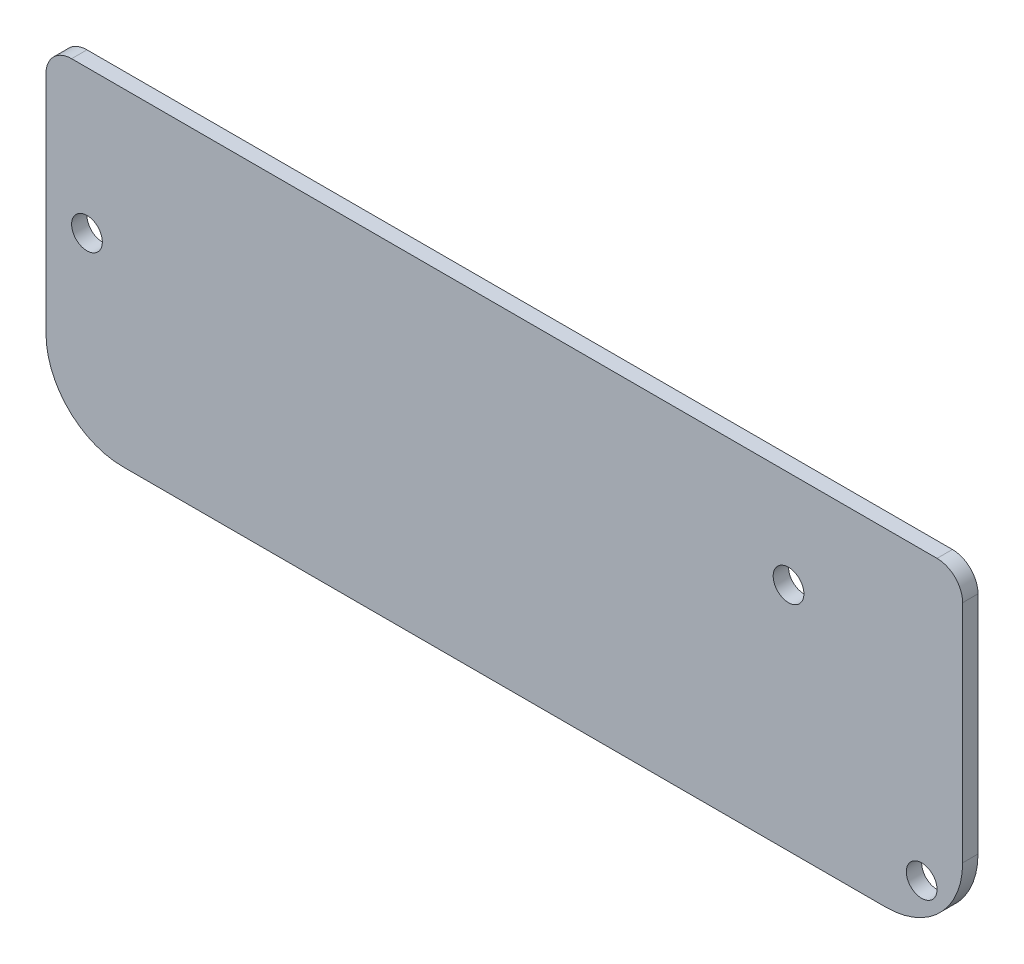
ISO-10303-21;
HEADER;
FILE_DESCRIPTION(('STEP AP214'),'2;1');
FILE_NAME('part.step','',(''),(''),'','','');
FILE_SCHEMA(('AUTOMOTIVE_DESIGN { 1 0 10303 214 1 1 1 1 }'));
ENDSEC;
DATA;
#1=APPLICATION_CONTEXT('core data for automotive mechanical design processes');
#2=APPLICATION_PROTOCOL_DEFINITION('international standard','automotive_design',2000,#1);
#3=PRODUCT_CONTEXT('',#1,'mechanical');
#4=PRODUCT('Part','Part','',(#3));
#5=PRODUCT_RELATED_PRODUCT_CATEGORY('part','',(#4));
#6=PRODUCT_DEFINITION_FORMATION('','',#4);
#7=PRODUCT_DEFINITION_CONTEXT('part definition',#1,'design');
#8=PRODUCT_DEFINITION('design','',#6,#7);
#9=PRODUCT_DEFINITION_SHAPE('','',#8);
#10=(LENGTH_UNIT() NAMED_UNIT(*) SI_UNIT(.MILLI.,.METRE.));
#11=(NAMED_UNIT(*) PLANE_ANGLE_UNIT() SI_UNIT($,.RADIAN.));
#12=(NAMED_UNIT(*) SI_UNIT($,.STERADIAN.) SOLID_ANGLE_UNIT());
#13=UNCERTAINTY_MEASURE_WITH_UNIT(LENGTH_MEASURE(1.E-05),#10,'distance_accuracy_value','');
#14=(GEOMETRIC_REPRESENTATION_CONTEXT(3) GLOBAL_UNCERTAINTY_ASSIGNED_CONTEXT((#13)) GLOBAL_UNIT_ASSIGNED_CONTEXT((#10,
#11,#12)) REPRESENTATION_CONTEXT('',''));
#15=CARTESIAN_POINT('',(0.,0.,0.));
#16=DIRECTION('',(0.,0.,1.));
#17=DIRECTION('',(1.,0.,0.));
#18=AXIS2_PLACEMENT_3D('',#15,#16,#17);
#19=CARTESIAN_POINT('',(277.101682981005,137.632253408396,3.));
#20=DIRECTION('',(0.,0.,-1.));
#21=DIRECTION('',(-1.,0.,0.));
#22=AXIS2_PLACEMENT_3D('',#19,#20,#21);
#23=CYLINDRICAL_SURFACE('',#22,5.);
#24=CARTESIAN_POINT('',(277.101682981005,137.632253408396,0.));
#25=DIRECTION('',(0.,0.,1.));
#26=DIRECTION('',(-1.,0.,0.));
#27=AXIS2_PLACEMENT_3D('',#24,#25,#26);
#28=CIRCLE('',#27,5.);
#29=CARTESIAN_POINT('',(282.101682981005,137.632253408396,0.));
#30=VERTEX_POINT('',#29);
#31=CARTESIAN_POINT('',(277.101682981005,142.632253408396,0.));
#32=VERTEX_POINT('',#31);
#33=EDGE_CURVE('E129',#30,#32,#28,.T.);
#34=ORIENTED_EDGE('',*,*,#33,.T.);
#35=DIRECTION('',(0.,0.,-1.));
#36=VECTOR('',#35,1.);
#37=CARTESIAN_POINT('',(277.101682981005,142.632253408396,3.));
#38=LINE('',#37,#36);
#39=CARTESIAN_POINT('',(277.101682981005,142.632253408396,3.));
#40=VERTEX_POINT('',#39);
#41=EDGE_CURVE('E11',#40,#32,#38,.T.);
#42=ORIENTED_EDGE('',*,*,#41,.F.);
#43=CARTESIAN_POINT('',(277.101682981005,137.632253408396,3.));
#44=DIRECTION('',(0.,0.,1.));
#45=DIRECTION('',(-1.,0.,0.));
#46=AXIS2_PLACEMENT_3D('',#43,#44,#45);
#47=CIRCLE('',#46,5.);
#48=CARTESIAN_POINT('',(282.101682981005,137.632253408396,3.));
#49=VERTEX_POINT('',#48);
#50=EDGE_CURVE('E144',#49,#40,#47,.T.);
#51=ORIENTED_EDGE('',*,*,#50,.F.);
#52=DIRECTION('',(0.,0.,-1.));
#53=VECTOR('',#52,1.);
#54=CARTESIAN_POINT('',(282.101682981005,137.632253408396,3.));
#55=LINE('',#54,#53);
#56=EDGE_CURVE('E125',#49,#30,#55,.T.);
#57=ORIENTED_EDGE('',*,*,#56,.T.);
#58=EDGE_LOOP('',(#34,#42,#51,#57));
#59=FACE_BOUND('',#58,.T.);
#60=ADVANCED_FACE('F33',(#59),#23,.T.);
#61=CARTESIAN_POINT('',(108.101682981005,142.632253408396,3.));
#62=DIRECTION('',(0.,-1.,0.));
#63=DIRECTION('',(0.,0.,-1.));
#64=AXIS2_PLACEMENT_3D('',#61,#62,#63);
#65=PLANE('',#64);
#66=DIRECTION('',(-1.,0.,0.));
#67=VECTOR('',#66,1.);
#68=CARTESIAN_POINT('',(108.101682981005,142.632253408396,0.));
#69=LINE('',#68,#67);
#70=CARTESIAN_POINT('',(108.101682981005,142.632253408396,0.));
#71=VERTEX_POINT('',#70);
#72=EDGE_CURVE('E132',#32,#71,#69,.T.);
#73=ORIENTED_EDGE('',*,*,#72,.T.);
#74=DIRECTION('',(0.,0.,-1.));
#75=VECTOR('',#74,1.);
#76=CARTESIAN_POINT('',(108.101682981005,142.632253408396,3.));
#77=LINE('',#76,#75);
#78=CARTESIAN_POINT('',(108.101682981005,142.632253408396,3.));
#79=VERTEX_POINT('',#78);
#80=EDGE_CURVE('E41',#79,#71,#77,.T.);
#81=ORIENTED_EDGE('',*,*,#80,.F.);
#82=DIRECTION('',(-1.,0.,0.));
#83=VECTOR('',#82,1.);
#84=CARTESIAN_POINT('',(108.101682981005,142.632253408396,3.));
#85=LINE('',#84,#83);
#86=EDGE_CURVE('E92',#40,#79,#85,.T.);
#87=ORIENTED_EDGE('',*,*,#86,.F.);
#88=ORIENTED_EDGE('',*,*,#41,.T.);
#89=EDGE_LOOP('',(#73,#81,#87,#88));
#90=FACE_BOUND('',#89,.T.);
#91=ADVANCED_FACE('F224',(#90),#65,.F.);
#92=CARTESIAN_POINT('',(108.101682981005,137.632253408396,3.));
#93=DIRECTION('',(0.,0.,-1.));
#94=DIRECTION('',(-1.,0.,0.));
#95=AXIS2_PLACEMENT_3D('',#92,#93,#94);
#96=CYLINDRICAL_SURFACE('',#95,5.);
#97=CARTESIAN_POINT('',(108.101682981005,137.632253408396,0.));
#98=DIRECTION('',(0.,0.,1.));
#99=DIRECTION('',(-1.,0.,0.));
#100=AXIS2_PLACEMENT_3D('',#97,#98,#99);
#101=CIRCLE('',#100,5.);
#102=CARTESIAN_POINT('',(103.101682981005,137.632253408396,0.));
#103=VERTEX_POINT('',#102);
#104=EDGE_CURVE('E135',#71,#103,#101,.T.);
#105=ORIENTED_EDGE('',*,*,#104,.T.);
#106=DIRECTION('',(0.,0.,-1.));
#107=VECTOR('',#106,1.);
#108=CARTESIAN_POINT('',(103.101682981005,137.632253408396,3.));
#109=LINE('',#108,#107);
#110=CARTESIAN_POINT('',(103.101682981005,137.632253408396,3.));
#111=VERTEX_POINT('',#110);
#112=EDGE_CURVE('E151',#111,#103,#109,.T.);
#113=ORIENTED_EDGE('',*,*,#112,.F.);
#114=CARTESIAN_POINT('',(108.101682981005,137.632253408396,3.));
#115=DIRECTION('',(0.,0.,1.));
#116=DIRECTION('',(-1.,0.,0.));
#117=AXIS2_PLACEMENT_3D('',#114,#115,#116);
#118=CIRCLE('',#117,5.);
#119=EDGE_CURVE('E159',#79,#111,#118,.T.);
#120=ORIENTED_EDGE('',*,*,#119,.F.);
#121=ORIENTED_EDGE('',*,*,#80,.T.);
#122=EDGE_LOOP('',(#105,#113,#120,#121));
#123=FACE_BOUND('',#122,.T.);
#124=ADVANCED_FACE('F157',(#123),#96,.T.);
#125=CARTESIAN_POINT('',(103.101682981005,93.6322534083958,3.));
#126=DIRECTION('',(1.,0.,0.));
#127=DIRECTION('',(0.,1.,0.));
#128=AXIS2_PLACEMENT_3D('',#125,#126,#127);
#129=PLANE('',#128);
#130=DIRECTION('',(0.,-1.,0.));
#131=VECTOR('',#130,1.);
#132=CARTESIAN_POINT('',(103.101682981005,93.6322534083958,0.));
#133=LINE('',#132,#131);
#134=CARTESIAN_POINT('',(103.101682981005,93.6322534083958,0.));
#135=VERTEX_POINT('',#134);
#136=EDGE_CURVE('E137',#103,#135,#133,.T.);
#137=ORIENTED_EDGE('',*,*,#136,.T.);
#138=DIRECTION('',(0.,0.,-1.));
#139=VECTOR('',#138,1.);
#140=CARTESIAN_POINT('',(103.101682981005,93.6322534083958,3.));
#141=LINE('',#140,#139);
#142=CARTESIAN_POINT('',(103.101682981005,93.6322534083958,3.));
#143=VERTEX_POINT('',#142);
#144=EDGE_CURVE('E148',#143,#135,#141,.T.);
#145=ORIENTED_EDGE('',*,*,#144,.F.);
#146=DIRECTION('',(0.,-1.,0.));
#147=VECTOR('',#146,1.);
#148=CARTESIAN_POINT('',(103.101682981005,93.6322534083958,3.));
#149=LINE('',#148,#147);
#150=EDGE_CURVE('E171',#111,#143,#149,.T.);
#151=ORIENTED_EDGE('',*,*,#150,.F.);
#152=ORIENTED_EDGE('',*,*,#112,.T.);
#153=EDGE_LOOP('',(#137,#145,#151,#152));
#154=FACE_BOUND('',#153,.T.);
#155=ADVANCED_FACE('F167',(#154),#129,.F.);
#156=CARTESIAN_POINT('',(118.101682981005,93.6322534083957,3.));
#157=DIRECTION('',(0.,0.,-1.));
#158=DIRECTION('',(-1.,0.,0.));
#159=AXIS2_PLACEMENT_3D('',#156,#157,#158);
#160=CYLINDRICAL_SURFACE('',#159,15.);
#161=CARTESIAN_POINT('',(118.101682981005,93.6322534083957,0.));
#162=DIRECTION('',(0.,0.,1.));
#163=DIRECTION('',(-1.,0.,0.));
#164=AXIS2_PLACEMENT_3D('',#161,#162,#163);
#165=CIRCLE('',#164,15.);
#166=CARTESIAN_POINT('',(118.101682981005,78.6322534083957,0.));
#167=VERTEX_POINT('',#166);
#168=EDGE_CURVE('E139',#135,#167,#165,.T.);
#169=ORIENTED_EDGE('',*,*,#168,.T.);
#170=DIRECTION('',(0.,0.,-1.));
#171=VECTOR('',#170,1.);
#172=CARTESIAN_POINT('',(118.101682981005,78.6322534083957,3.));
#173=LINE('',#172,#171);
#174=CARTESIAN_POINT('',(118.101682981005,78.6322534083957,3.));
#175=VERTEX_POINT('',#174);
#176=EDGE_CURVE('E120',#175,#167,#173,.T.);
#177=ORIENTED_EDGE('',*,*,#176,.F.);
#178=CARTESIAN_POINT('',(118.101682981005,93.6322534083957,3.));
#179=DIRECTION('',(0.,0.,1.));
#180=DIRECTION('',(-1.,0.,0.));
#181=AXIS2_PLACEMENT_3D('',#178,#179,#180);
#182=CIRCLE('',#181,15.);
#183=EDGE_CURVE('E111',#143,#175,#182,.T.);
#184=ORIENTED_EDGE('',*,*,#183,.F.);
#185=ORIENTED_EDGE('',*,*,#144,.T.);
#186=EDGE_LOOP('',(#169,#177,#184,#185));
#187=FACE_BOUND('',#186,.T.);
#188=ADVANCED_FACE('F170',(#187),#160,.T.);
#189=CARTESIAN_POINT('',(118.101682981005,78.6322534083957,3.));
#190=DIRECTION('',(0.,1.,0.));
#191=DIRECTION('',(0.,0.,1.));
#192=AXIS2_PLACEMENT_3D('',#189,#190,#191);
#193=PLANE('',#192);
#194=DIRECTION('',(1.,0.,0.));
#195=VECTOR('',#194,1.);
#196=CARTESIAN_POINT('',(118.101682981005,78.6322534083957,0.));
#197=LINE('',#196,#195);
#198=CARTESIAN_POINT('',(267.101682981005,78.6322534083957,0.));
#199=VERTEX_POINT('',#198);
#200=EDGE_CURVE('E119',#167,#199,#197,.T.);
#201=ORIENTED_EDGE('',*,*,#200,.T.);
#202=DIRECTION('',(0.,0.,-1.));
#203=VECTOR('',#202,1.);
#204=CARTESIAN_POINT('',(267.101682981005,78.6322534083957,3.));
#205=LINE('',#204,#203);
#206=CARTESIAN_POINT('',(267.101682981005,78.6322534083957,3.));
#207=VERTEX_POINT('',#206);
#208=EDGE_CURVE('E116',#207,#199,#205,.T.);
#209=ORIENTED_EDGE('',*,*,#208,.F.);
#210=DIRECTION('',(1.,0.,0.));
#211=VECTOR('',#210,1.);
#212=CARTESIAN_POINT('',(118.101682981005,78.6322534083957,3.));
#213=LINE('',#212,#211);
#214=EDGE_CURVE('E105',#175,#207,#213,.T.);
#215=ORIENTED_EDGE('',*,*,#214,.F.);
#216=ORIENTED_EDGE('',*,*,#176,.T.);
#217=EDGE_LOOP('',(#201,#209,#215,#216));
#218=FACE_BOUND('',#217,.T.);
#219=ADVANCED_FACE('F117',(#218),#193,.F.);
#220=CARTESIAN_POINT('',(267.101682981005,93.6322534083957,3.));
#221=DIRECTION('',(0.,0.,-1.));
#222=DIRECTION('',(-1.,0.,0.));
#223=AXIS2_PLACEMENT_3D('',#220,#221,#222);
#224=CYLINDRICAL_SURFACE('',#223,15.);
#225=CARTESIAN_POINT('',(267.101682981005,93.6322534083957,0.));
#226=DIRECTION('',(0.,0.,1.));
#227=DIRECTION('',(1.,0.,0.));
#228=AXIS2_PLACEMENT_3D('',#225,#226,#227);
#229=CIRCLE('',#228,15.);
#230=CARTESIAN_POINT('',(282.101682981005,93.6322534083957,0.));
#231=VERTEX_POINT('',#230);
#232=EDGE_CURVE('E78',#199,#231,#229,.T.);
#233=ORIENTED_EDGE('',*,*,#232,.T.);
#234=DIRECTION('',(0.,0.,-1.));
#235=VECTOR('',#234,1.);
#236=CARTESIAN_POINT('',(282.101682981005,93.6322534083957,3.));
#237=LINE('',#236,#235);
#238=CARTESIAN_POINT('',(282.101682981005,93.6322534083957,3.));
#239=VERTEX_POINT('',#238);
#240=EDGE_CURVE('E121',#239,#231,#237,.T.);
#241=ORIENTED_EDGE('',*,*,#240,.F.);
#242=CARTESIAN_POINT('',(267.101682981005,93.6322534083957,3.));
#243=DIRECTION('',(0.,0.,1.));
#244=DIRECTION('',(1.,0.,0.));
#245=AXIS2_PLACEMENT_3D('',#242,#243,#244);
#246=CIRCLE('',#245,15.);
#247=EDGE_CURVE('E109',#207,#239,#246,.T.);
#248=ORIENTED_EDGE('',*,*,#247,.F.);
#249=ORIENTED_EDGE('',*,*,#208,.T.);
#250=EDGE_LOOP('',(#233,#241,#248,#249));
#251=FACE_BOUND('',#250,.T.);
#252=ADVANCED_FACE('F123',(#251),#224,.T.);
#253=CARTESIAN_POINT('',(282.101682981005,93.6322534083958,3.));
#254=DIRECTION('',(-1.,0.,0.));
#255=DIRECTION('',(0.,0.,1.));
#256=AXIS2_PLACEMENT_3D('',#253,#254,#255);
#257=PLANE('',#256);
#258=DIRECTION('',(0.,1.,0.));
#259=VECTOR('',#258,1.);
#260=CARTESIAN_POINT('',(282.101682981005,93.6322534083958,0.));
#261=LINE('',#260,#259);
#262=EDGE_CURVE('E84',#231,#30,#261,.T.);
#263=ORIENTED_EDGE('',*,*,#262,.T.);
#264=ORIENTED_EDGE('',*,*,#56,.F.);
#265=DIRECTION('',(0.,1.,0.));
#266=VECTOR('',#265,1.);
#267=CARTESIAN_POINT('',(282.101682981005,93.6322534083958,3.));
#268=LINE('',#267,#266);
#269=EDGE_CURVE('E49',#239,#49,#268,.T.);
#270=ORIENTED_EDGE('',*,*,#269,.F.);
#271=ORIENTED_EDGE('',*,*,#240,.T.);
#272=EDGE_LOOP('',(#263,#264,#270,#271));
#273=FACE_BOUND('',#272,.T.);
#274=ADVANCED_FACE('F231',(#273),#257,.F.);
#275=CARTESIAN_POINT('',(277.101682981005,137.632253408396,3.));
#276=DIRECTION('',(0.,0.,-1.));
#277=DIRECTION('',(-1.,0.,0.));
#278=AXIS2_PLACEMENT_3D('',#275,#276,#277);
#279=PLANE('',#278);
#280=CARTESIAN_POINT('',(111.101682981005,114.632253408396,3.));
#281=DIRECTION('',(0.,0.,-1.));
#282=DIRECTION('',(-1.,0.,0.));
#283=AXIS2_PLACEMENT_3D('',#280,#281,#282);
#284=CIRCLE('',#283,3.00000000000001);
#285=CARTESIAN_POINT('',(108.101682981005,114.632253408396,3.));
#286=VERTEX_POINT('',#285);
#287=EDGE_CURVE('E133',#286,#286,#284,.T.);
#288=ORIENTED_EDGE('',*,*,#287,.T.);
#289=EDGE_LOOP('',(#288));
#290=FACE_BOUND('',#289,.T.);
#291=CARTESIAN_POINT('',(248.101682981005,123.632253408396,3.));
#292=DIRECTION('',(0.,0.,-1.));
#293=DIRECTION('',(-1.,0.,0.));
#294=AXIS2_PLACEMENT_3D('',#291,#292,#293);
#295=CIRCLE('',#294,2.99999999999999);
#296=CARTESIAN_POINT('',(245.101682981005,123.632253408396,3.));
#297=VERTEX_POINT('',#296);
#298=EDGE_CURVE('E183',#297,#297,#295,.T.);
#299=ORIENTED_EDGE('',*,*,#298,.T.);
#300=EDGE_LOOP('',(#299));
#301=FACE_BOUND('',#300,.T.);
#302=CARTESIAN_POINT('',(274.101682981005,86.6322534083957,3.));
#303=DIRECTION('',(0.,0.,-1.));
#304=DIRECTION('',(-1.,0.,0.));
#305=AXIS2_PLACEMENT_3D('',#302,#303,#304);
#306=CIRCLE('',#305,2.99999999999999);
#307=CARTESIAN_POINT('',(271.101682981005,86.6322534083957,3.));
#308=VERTEX_POINT('',#307);
#309=EDGE_CURVE('E177',#308,#308,#306,.T.);
#310=ORIENTED_EDGE('',*,*,#309,.T.);
#311=EDGE_LOOP('',(#310));
#312=FACE_BOUND('',#311,.T.);
#313=ORIENTED_EDGE('',*,*,#50,.T.);
#314=ORIENTED_EDGE('',*,*,#86,.T.);
#315=ORIENTED_EDGE('',*,*,#119,.T.);
#316=ORIENTED_EDGE('',*,*,#150,.T.);
#317=ORIENTED_EDGE('',*,*,#183,.T.);
#318=ORIENTED_EDGE('',*,*,#214,.T.);
#319=ORIENTED_EDGE('',*,*,#247,.T.);
#320=ORIENTED_EDGE('',*,*,#269,.T.);
#321=EDGE_LOOP('',(#313,#314,#315,#316,#317,#318,#319,#320));
#322=FACE_BOUND('',#321,.T.);
#323=ADVANCED_FACE('F107',(#290,#301,#312,#322),#279,.F.);
#324=CARTESIAN_POINT('',(277.101682981005,137.632253408396,0.));
#325=DIRECTION('',(0.,0.,-1.));
#326=DIRECTION('',(-1.,0.,0.));
#327=AXIS2_PLACEMENT_3D('',#324,#325,#326);
#328=PLANE('',#327);
#329=CARTESIAN_POINT('',(111.101682981005,114.632253408396,0.));
#330=DIRECTION('',(0.,0.,-1.));
#331=DIRECTION('',(-1.,0.,0.));
#332=AXIS2_PLACEMENT_3D('',#329,#330,#331);
#333=CIRCLE('',#332,3.00000000000001);
#334=CARTESIAN_POINT('',(108.101682981005,114.632253408396,0.));
#335=VERTEX_POINT('',#334);
#336=EDGE_CURVE('E189',#335,#335,#333,.T.);
#337=ORIENTED_EDGE('',*,*,#336,.F.);
#338=EDGE_LOOP('',(#337));
#339=FACE_BOUND('',#338,.T.);
#340=CARTESIAN_POINT('',(248.101682981005,123.632253408396,0.));
#341=DIRECTION('',(0.,0.,-1.));
#342=DIRECTION('',(-1.,0.,0.));
#343=AXIS2_PLACEMENT_3D('',#340,#341,#342);
#344=CIRCLE('',#343,2.99999999999999);
#345=CARTESIAN_POINT('',(245.101682981005,123.632253408396,0.));
#346=VERTEX_POINT('',#345);
#347=EDGE_CURVE('E186',#346,#346,#344,.T.);
#348=ORIENTED_EDGE('',*,*,#347,.F.);
#349=EDGE_LOOP('',(#348));
#350=FACE_BOUND('',#349,.T.);
#351=CARTESIAN_POINT('',(274.101682981005,86.6322534083957,0.));
#352=DIRECTION('',(0.,0.,-1.));
#353=DIRECTION('',(-1.,0.,0.));
#354=AXIS2_PLACEMENT_3D('',#351,#352,#353);
#355=CIRCLE('',#354,2.99999999999999);
#356=CARTESIAN_POINT('',(271.101682981005,86.6322534083957,0.));
#357=VERTEX_POINT('',#356);
#358=EDGE_CURVE('E180',#357,#357,#355,.T.);
#359=ORIENTED_EDGE('',*,*,#358,.F.);
#360=EDGE_LOOP('',(#359));
#361=FACE_BOUND('',#360,.T.);
#362=ORIENTED_EDGE('',*,*,#33,.F.);
#363=ORIENTED_EDGE('',*,*,#262,.F.);
#364=ORIENTED_EDGE('',*,*,#232,.F.);
#365=ORIENTED_EDGE('',*,*,#200,.F.);
#366=ORIENTED_EDGE('',*,*,#168,.F.);
#367=ORIENTED_EDGE('',*,*,#136,.F.);
#368=ORIENTED_EDGE('',*,*,#104,.F.);
#369=ORIENTED_EDGE('',*,*,#72,.F.);
#370=EDGE_LOOP('',(#362,#363,#364,#365,#366,#367,#368,#369));
#371=FACE_BOUND('',#370,.T.);
#372=ADVANCED_FACE('F163',(#339,#350,#361,#371),#328,.T.);
#373=CARTESIAN_POINT('',(274.101682981005,86.6322534083957,3.));
#374=DIRECTION('',(0.,0.,-1.));
#375=DIRECTION('',(-1.,0.,0.));
#376=AXIS2_PLACEMENT_3D('',#373,#374,#375);
#377=CYLINDRICAL_SURFACE('',#376,2.99999999999999);
#378=ORIENTED_EDGE('',*,*,#309,.F.);
#379=EDGE_LOOP('',(#378));
#380=FACE_BOUND('',#379,.T.);
#381=ORIENTED_EDGE('',*,*,#358,.T.);
#382=EDGE_LOOP('',(#381));
#383=FACE_BOUND('',#382,.T.);
#384=ADVANCED_FACE('F206',(#380,#383),#377,.F.);
#385=CARTESIAN_POINT('',(248.101682981005,123.632253408396,3.));
#386=DIRECTION('',(0.,0.,-1.));
#387=DIRECTION('',(-1.,0.,0.));
#388=AXIS2_PLACEMENT_3D('',#385,#386,#387);
#389=CYLINDRICAL_SURFACE('',#388,2.99999999999999);
#390=ORIENTED_EDGE('',*,*,#298,.F.);
#391=EDGE_LOOP('',(#390));
#392=FACE_BOUND('',#391,.T.);
#393=ORIENTED_EDGE('',*,*,#347,.T.);
#394=EDGE_LOOP('',(#393));
#395=FACE_BOUND('',#394,.T.);
#396=ADVANCED_FACE('F200',(#392,#395),#389,.F.);
#397=CARTESIAN_POINT('',(111.101682981005,114.632253408396,3.));
#398=DIRECTION('',(0.,0.,-1.));
#399=DIRECTION('',(-1.,0.,0.));
#400=AXIS2_PLACEMENT_3D('',#397,#398,#399);
#401=CYLINDRICAL_SURFACE('',#400,3.00000000000001);
#402=ORIENTED_EDGE('',*,*,#287,.F.);
#403=EDGE_LOOP('',(#402));
#404=FACE_BOUND('',#403,.T.);
#405=ORIENTED_EDGE('',*,*,#336,.T.);
#406=EDGE_LOOP('',(#405));
#407=FACE_BOUND('',#406,.T.);
#408=ADVANCED_FACE('F197',(#404,#407),#401,.F.);
#409=CLOSED_SHELL('',(#60,#91,#124,#155,#188,#219,#252,#274,#323,#372,#384,#396,#408));
#410=MANIFOLD_SOLID_BREP('B2',#409);
#411=ADVANCED_BREP_SHAPE_REPRESENTATION('',(#18,#410),#14);
#412=SHAPE_DEFINITION_REPRESENTATION(#9,#411);
ENDSEC;
END-ISO-10303-21;
